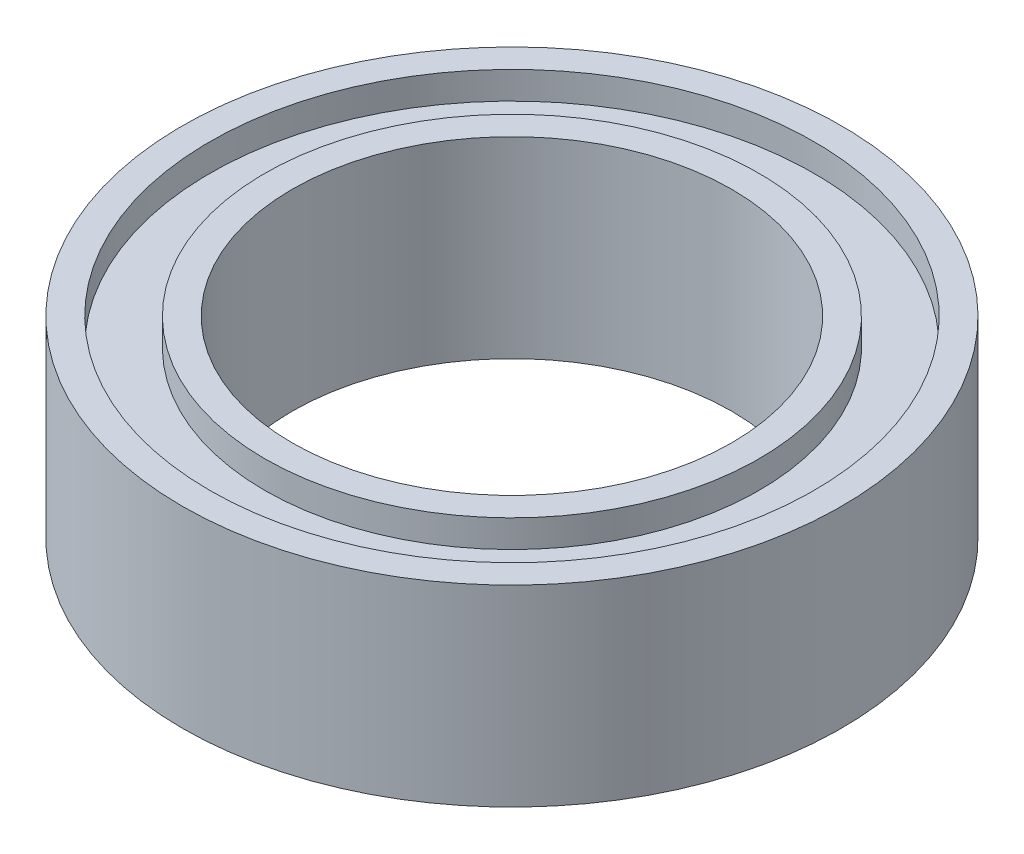
ISO-10303-21;
HEADER;
FILE_DESCRIPTION(('STEP AP214'),'2;1');
FILE_NAME('part.step','',(''),(''),'','','');
FILE_SCHEMA(('AUTOMOTIVE_DESIGN { 1 0 10303 214 1 1 1 1 }'));
ENDSEC;
DATA;
#1=APPLICATION_CONTEXT('core data for automotive mechanical design processes');
#2=APPLICATION_PROTOCOL_DEFINITION('international standard','automotive_design',2000,#1);
#3=PRODUCT_CONTEXT('',#1,'mechanical');
#4=PRODUCT('Part','Part','',(#3));
#5=PRODUCT_RELATED_PRODUCT_CATEGORY('part','',(#4));
#6=PRODUCT_DEFINITION_FORMATION('','',#4);
#7=PRODUCT_DEFINITION_CONTEXT('part definition',#1,'design');
#8=PRODUCT_DEFINITION('design','',#6,#7);
#9=PRODUCT_DEFINITION_SHAPE('','',#8);
#10=(LENGTH_UNIT() NAMED_UNIT(*) SI_UNIT(.MILLI.,.METRE.));
#11=(NAMED_UNIT(*) PLANE_ANGLE_UNIT() SI_UNIT($,.RADIAN.));
#12=(NAMED_UNIT(*) SI_UNIT($,.STERADIAN.) SOLID_ANGLE_UNIT());
#13=UNCERTAINTY_MEASURE_WITH_UNIT(LENGTH_MEASURE(1.E-05),#10,'distance_accuracy_value','');
#14=(GEOMETRIC_REPRESENTATION_CONTEXT(3) GLOBAL_UNCERTAINTY_ASSIGNED_CONTEXT((#13)) GLOBAL_UNIT_ASSIGNED_CONTEXT((#10,
#11,#12)) REPRESENTATION_CONTEXT('',''));
#15=CARTESIAN_POINT('',(0.,0.,0.));
#16=DIRECTION('',(0.,0.,1.));
#17=DIRECTION('',(1.,0.,0.));
#18=AXIS2_PLACEMENT_3D('',#15,#16,#17);
#19=CARTESIAN_POINT('',(0.,0.,0.));
#20=DIRECTION('',(0.,1.,0.));
#21=DIRECTION('',(0.,0.,1.));
#22=AXIS2_PLACEMENT_3D('',#19,#20,#21);
#23=PLANE('',#22);
#24=CARTESIAN_POINT('',(0.,0.,0.));
#25=DIRECTION('',(0.,1.,0.));
#26=DIRECTION('',(0.,0.,1.));
#27=AXIS2_PLACEMENT_3D('',#24,#25,#26);
#28=CIRCLE('',#27,4.);
#29=CARTESIAN_POINT('',(0.,0.,4.));
#30=VERTEX_POINT('',#29);
#31=EDGE_CURVE('E70',#30,#30,#28,.T.);
#32=ORIENTED_EDGE('',*,*,#31,.T.);
#33=EDGE_LOOP('',(#32));
#34=FACE_BOUND('',#33,.T.);
#35=CARTESIAN_POINT('',(0.,0.,0.));
#36=DIRECTION('',(0.,1.,0.));
#37=DIRECTION('',(0.,0.,1.));
#38=AXIS2_PLACEMENT_3D('',#35,#36,#37);
#39=CIRCLE('',#38,4.5);
#40=CARTESIAN_POINT('',(0.,0.,4.5));
#41=VERTEX_POINT('',#40);
#42=EDGE_CURVE('E98',#41,#41,#39,.T.);
#43=ORIENTED_EDGE('',*,*,#42,.F.);
#44=EDGE_LOOP('',(#43));
#45=FACE_BOUND('',#44,.T.);
#46=ADVANCED_FACE('F59',(#34,#45),#23,.F.);
#47=CARTESIAN_POINT('',(0.,3.5,0.));
#48=DIRECTION('',(0.,1.,0.));
#49=DIRECTION('',(0.,0.,1.));
#50=AXIS2_PLACEMENT_3D('',#47,#48,#49);
#51=PLANE('',#50);
#52=CARTESIAN_POINT('',(0.,3.5,0.));
#53=DIRECTION('',(0.,1.,0.));
#54=DIRECTION('',(0.,0.,1.));
#55=AXIS2_PLACEMENT_3D('',#52,#53,#54);
#56=CIRCLE('',#55,4.5);
#57=CARTESIAN_POINT('',(0.,3.5,4.5));
#58=VERTEX_POINT('',#57);
#59=EDGE_CURVE('E11',#58,#58,#56,.T.);
#60=ORIENTED_EDGE('',*,*,#59,.T.);
#61=EDGE_LOOP('',(#60));
#62=FACE_BOUND('',#61,.T.);
#63=CARTESIAN_POINT('',(0.,3.5,0.));
#64=DIRECTION('',(0.,1.,0.));
#65=DIRECTION('',(0.,0.,1.));
#66=AXIS2_PLACEMENT_3D('',#63,#64,#65);
#67=CIRCLE('',#66,4.);
#68=CARTESIAN_POINT('',(0.,3.5,4.));
#69=VERTEX_POINT('',#68);
#70=EDGE_CURVE('E66',#69,#69,#67,.T.);
#71=ORIENTED_EDGE('',*,*,#70,.F.);
#72=EDGE_LOOP('',(#71));
#73=FACE_BOUND('',#72,.T.);
#74=ADVANCED_FACE('F114',(#62,#73),#51,.T.);
#75=CARTESIAN_POINT('',(0.,0.,0.));
#76=DIRECTION('',(0.,1.,0.));
#77=DIRECTION('',(0.,0.,1.));
#78=AXIS2_PLACEMENT_3D('',#75,#76,#77);
#79=CIRCLE('',#78,5.5);
#80=CARTESIAN_POINT('',(0.,0.,5.5));
#81=VERTEX_POINT('',#80);
#82=EDGE_CURVE('E92',#81,#81,#79,.T.);
#83=ORIENTED_EDGE('',*,*,#82,.T.);
#84=EDGE_LOOP('',(#83));
#85=FACE_BOUND('',#84,.T.);
#86=CARTESIAN_POINT('',(0.,0.,0.));
#87=DIRECTION('',(0.,1.,0.));
#88=DIRECTION('',(0.,0.,1.));
#89=AXIS2_PLACEMENT_3D('',#86,#87,#88);
#90=CIRCLE('',#89,6.);
#91=CARTESIAN_POINT('',(0.,0.,6.));
#92=VERTEX_POINT('',#91);
#93=EDGE_CURVE('E83',#92,#92,#90,.T.);
#94=ORIENTED_EDGE('',*,*,#93,.F.);
#95=EDGE_LOOP('',(#94));
#96=FACE_BOUND('',#95,.T.);
#97=ADVANCED_FACE('F116',(#85,#96),#23,.F.);
#98=CARTESIAN_POINT('',(0.,3.5,0.));
#99=DIRECTION('',(0.,-1.,0.));
#100=DIRECTION('',(0.,0.,-1.));
#101=AXIS2_PLACEMENT_3D('',#98,#99,#100);
#102=CYLINDRICAL_SURFACE('',#101,4.5);
#103=CARTESIAN_POINT('',(0.,3.,0.));
#104=DIRECTION('',(0.,1.,0.));
#105=DIRECTION('',(0.,0.,1.));
#106=AXIS2_PLACEMENT_3D('',#103,#104,#105);
#107=CIRCLE('',#106,4.5);
#108=CARTESIAN_POINT('',(0.,3.,4.5));
#109=VERTEX_POINT('',#108);
#110=EDGE_CURVE('E75',#109,#109,#107,.T.);
#111=ORIENTED_EDGE('',*,*,#110,.T.);
#112=EDGE_LOOP('',(#111));
#113=FACE_BOUND('',#112,.T.);
#114=ORIENTED_EDGE('',*,*,#59,.F.);
#115=EDGE_LOOP('',(#114));
#116=FACE_BOUND('',#115,.T.);
#117=ADVANCED_FACE('F61',(#113,#116),#102,.T.);
#118=CARTESIAN_POINT('',(0.,3.5,0.));
#119=DIRECTION('',(0.,-1.,0.));
#120=DIRECTION('',(0.,0.,-1.));
#121=AXIS2_PLACEMENT_3D('',#118,#119,#120);
#122=CYLINDRICAL_SURFACE('',#121,4.);
#123=ORIENTED_EDGE('',*,*,#70,.T.);
#124=EDGE_LOOP('',(#123));
#125=FACE_BOUND('',#124,.T.);
#126=ORIENTED_EDGE('',*,*,#31,.F.);
#127=EDGE_LOOP('',(#126));
#128=FACE_BOUND('',#127,.T.);
#129=ADVANCED_FACE('F126',(#125,#128),#122,.F.);
#130=CARTESIAN_POINT('',(0.,3.,0.));
#131=DIRECTION('',(0.,1.,0.));
#132=DIRECTION('',(0.,0.,1.));
#133=AXIS2_PLACEMENT_3D('',#130,#131,#132);
#134=PLANE('',#133);
#135=CARTESIAN_POINT('',(0.,3.,0.));
#136=DIRECTION('',(0.,1.,0.));
#137=DIRECTION('',(0.,0.,1.));
#138=AXIS2_PLACEMENT_3D('',#135,#136,#137);
#139=CIRCLE('',#138,5.5);
#140=CARTESIAN_POINT('',(0.,3.,5.5));
#141=VERTEX_POINT('',#140);
#142=EDGE_CURVE('E79',#141,#141,#139,.F.);
#143=ORIENTED_EDGE('',*,*,#142,.F.);
#144=EDGE_LOOP('',(#143));
#145=FACE_BOUND('',#144,.T.);
#146=ORIENTED_EDGE('',*,*,#110,.F.);
#147=EDGE_LOOP('',(#146));
#148=FACE_BOUND('',#147,.T.);
#149=ADVANCED_FACE('F144',(#145,#148),#134,.T.);
#150=CARTESIAN_POINT('',(0.,3.5,0.));
#151=DIRECTION('',(0.,1.,0.));
#152=DIRECTION('',(0.,0.,1.));
#153=AXIS2_PLACEMENT_3D('',#150,#151,#152);
#154=PLANE('',#153);
#155=CARTESIAN_POINT('',(0.,3.5,0.));
#156=DIRECTION('',(0.,1.,0.));
#157=DIRECTION('',(0.,0.,1.));
#158=AXIS2_PLACEMENT_3D('',#155,#156,#157);
#159=CIRCLE('',#158,6.);
#160=CARTESIAN_POINT('',(0.,3.5,6.));
#161=VERTEX_POINT('',#160);
#162=EDGE_CURVE('E82',#161,#161,#159,.T.);
#163=ORIENTED_EDGE('',*,*,#162,.T.);
#164=EDGE_LOOP('',(#163));
#165=FACE_BOUND('',#164,.T.);
#166=CARTESIAN_POINT('',(0.,3.5,0.));
#167=DIRECTION('',(0.,1.,0.));
#168=DIRECTION('',(0.,0.,1.));
#169=AXIS2_PLACEMENT_3D('',#166,#167,#168);
#170=CIRCLE('',#169,5.5);
#171=CARTESIAN_POINT('',(0.,3.5,5.5));
#172=VERTEX_POINT('',#171);
#173=EDGE_CURVE('E86',#172,#172,#170,.T.);
#174=ORIENTED_EDGE('',*,*,#173,.F.);
#175=EDGE_LOOP('',(#174));
#176=FACE_BOUND('',#175,.T.);
#177=ADVANCED_FACE('F135',(#165,#176),#154,.T.);
#178=CARTESIAN_POINT('',(0.,3.5,0.));
#179=DIRECTION('',(0.,-1.,0.));
#180=DIRECTION('',(0.,0.,-1.));
#181=AXIS2_PLACEMENT_3D('',#178,#179,#180);
#182=CYLINDRICAL_SURFACE('',#181,6.);
#183=ORIENTED_EDGE('',*,*,#162,.F.);
#184=EDGE_LOOP('',(#183));
#185=FACE_BOUND('',#184,.T.);
#186=ORIENTED_EDGE('',*,*,#93,.T.);
#187=EDGE_LOOP('',(#186));
#188=FACE_BOUND('',#187,.T.);
#189=ADVANCED_FACE('F132',(#185,#188),#182,.T.);
#190=CARTESIAN_POINT('',(0.,3.5,0.));
#191=DIRECTION('',(0.,-1.,0.));
#192=DIRECTION('',(0.,0.,-1.));
#193=AXIS2_PLACEMENT_3D('',#190,#191,#192);
#194=CYLINDRICAL_SURFACE('',#193,5.5);
#195=ORIENTED_EDGE('',*,*,#142,.T.);
#196=EDGE_LOOP('',(#195));
#197=FACE_BOUND('',#196,.T.);
#198=ORIENTED_EDGE('',*,*,#173,.T.);
#199=EDGE_LOOP('',(#198));
#200=FACE_BOUND('',#199,.T.);
#201=ADVANCED_FACE('F134',(#197,#200),#194,.F.);
#202=CARTESIAN_POINT('',(0.,0.5,0.));
#203=DIRECTION('',(0.,1.,0.));
#204=DIRECTION('',(0.,0.,1.));
#205=AXIS2_PLACEMENT_3D('',#202,#203,#204);
#206=PLANE('',#205);
#207=CARTESIAN_POINT('',(0.,0.5,0.));
#208=DIRECTION('',(0.,1.,0.));
#209=DIRECTION('',(0.,0.,1.));
#210=AXIS2_PLACEMENT_3D('',#207,#208,#209);
#211=CIRCLE('',#210,5.5);
#212=CARTESIAN_POINT('',(0.,0.5,5.5));
#213=VERTEX_POINT('',#212);
#214=EDGE_CURVE('E91',#213,#213,#211,.T.);
#215=ORIENTED_EDGE('',*,*,#214,.F.);
#216=EDGE_LOOP('',(#215));
#217=FACE_BOUND('',#216,.T.);
#218=CARTESIAN_POINT('',(0.,0.5,0.));
#219=DIRECTION('',(0.,1.,0.));
#220=DIRECTION('',(0.,0.,1.));
#221=AXIS2_PLACEMENT_3D('',#218,#219,#220);
#222=CIRCLE('',#221,4.5);
#223=CARTESIAN_POINT('',(0.,0.5,4.5));
#224=VERTEX_POINT('',#223);
#225=EDGE_CURVE('E95',#224,#224,#222,.T.);
#226=ORIENTED_EDGE('',*,*,#225,.T.);
#227=EDGE_LOOP('',(#226));
#228=FACE_BOUND('',#227,.T.);
#229=ADVANCED_FACE('F104',(#217,#228),#206,.F.);
#230=CARTESIAN_POINT('',(0.,0.5,0.));
#231=DIRECTION('',(0.,-1.,0.));
#232=DIRECTION('',(0.,0.,-1.));
#233=AXIS2_PLACEMENT_3D('',#230,#231,#232);
#234=CYLINDRICAL_SURFACE('',#233,5.5);
#235=ORIENTED_EDGE('',*,*,#214,.T.);
#236=EDGE_LOOP('',(#235));
#237=FACE_BOUND('',#236,.T.);
#238=ORIENTED_EDGE('',*,*,#82,.F.);
#239=EDGE_LOOP('',(#238));
#240=FACE_BOUND('',#239,.T.);
#241=ADVANCED_FACE('F109',(#237,#240),#234,.F.);
#242=CARTESIAN_POINT('',(0.,0.5,0.));
#243=DIRECTION('',(0.,-1.,0.));
#244=DIRECTION('',(0.,0.,-1.));
#245=AXIS2_PLACEMENT_3D('',#242,#243,#244);
#246=CYLINDRICAL_SURFACE('',#245,4.5);
#247=ORIENTED_EDGE('',*,*,#225,.F.);
#248=EDGE_LOOP('',(#247));
#249=FACE_BOUND('',#248,.T.);
#250=ORIENTED_EDGE('',*,*,#42,.T.);
#251=EDGE_LOOP('',(#250));
#252=FACE_BOUND('',#251,.T.);
#253=ADVANCED_FACE('F106',(#249,#252),#246,.T.);
#254=CLOSED_SHELL('',(#46,#74,#97,#117,#129,#149,#177,#189,#201,#229,#241,#253));
#255=MANIFOLD_SOLID_BREP('B2',#254);
#256=ADVANCED_BREP_SHAPE_REPRESENTATION('',(#18,#255),#14);
#257=SHAPE_DEFINITION_REPRESENTATION(#9,#256);
ENDSEC;
END-ISO-10303-21;
